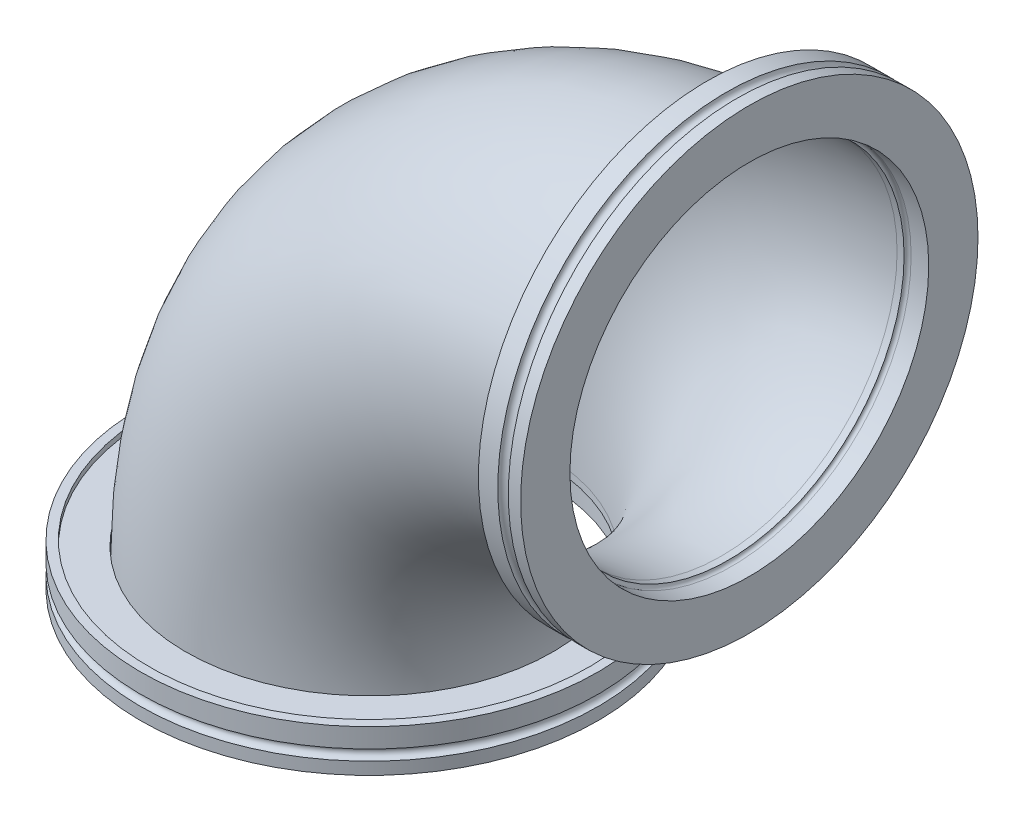
ISO-10303-21;
HEADER;
FILE_DESCRIPTION(('STEP AP214'),'2;1');
FILE_NAME('part.step','',(''),(''),'','','');
FILE_SCHEMA(('AUTOMOTIVE_DESIGN { 1 0 10303 214 1 1 1 1 }'));
ENDSEC;
DATA;
#1=APPLICATION_CONTEXT('core data for automotive mechanical design processes');
#2=APPLICATION_PROTOCOL_DEFINITION('international standard','automotive_design',2000,#1);
#3=PRODUCT_CONTEXT('',#1,'mechanical');
#4=PRODUCT('Part','Part','',(#3));
#5=PRODUCT_RELATED_PRODUCT_CATEGORY('part','',(#4));
#6=PRODUCT_DEFINITION_FORMATION('','',#4);
#7=PRODUCT_DEFINITION_CONTEXT('part definition',#1,'design');
#8=PRODUCT_DEFINITION('design','',#6,#7);
#9=PRODUCT_DEFINITION_SHAPE('','',#8);
#10=(LENGTH_UNIT() NAMED_UNIT(*) SI_UNIT(.MILLI.,.METRE.));
#11=(NAMED_UNIT(*) PLANE_ANGLE_UNIT() SI_UNIT($,.RADIAN.));
#12=(NAMED_UNIT(*) SI_UNIT($,.STERADIAN.) SOLID_ANGLE_UNIT());
#13=UNCERTAINTY_MEASURE_WITH_UNIT(LENGTH_MEASURE(1.E-05),#10,'distance_accuracy_value','');
#14=(GEOMETRIC_REPRESENTATION_CONTEXT(3) GLOBAL_UNCERTAINTY_ASSIGNED_CONTEXT((#13)) GLOBAL_UNIT_ASSIGNED_CONTEXT((#10,
#11,#12)) REPRESENTATION_CONTEXT('',''));
#15=CARTESIAN_POINT('',(0.,0.,0.));
#16=DIRECTION('',(0.,0.,1.));
#17=DIRECTION('',(1.,0.,0.));
#18=AXIS2_PLACEMENT_3D('',#15,#16,#17);
#19=CARTESIAN_POINT('',(3.50414142147315E-13,100.,3.49469700387223E-13));
#20=DIRECTION('',(-1.,0.,0.));
#21=DIRECTION('',(0.,0.,1.));
#22=AXIS2_PLACEMENT_3D('',#19,#20,#21);
#23=PLANE('',#22);
#24=CARTESIAN_POINT('',(3.49148133884313E-13,100.,0.));
#25=DIRECTION('',(1.,0.,0.));
#26=DIRECTION('',(0.,0.,1.));
#27=AXIS2_PLACEMENT_3D('',#24,#25,#26);
#28=CIRCLE('',#27,52.);
#29=CARTESIAN_POINT('',(1.6759110426447E-13,48.,0.));
#30=VERTEX_POINT('',#29);
#31=EDGE_CURVE('E96',#30,#30,#28,.T.);
#32=ORIENTED_EDGE('',*,*,#31,.T.);
#33=EDGE_LOOP('',(#32));
#34=FACE_BOUND('',#33,.T.);
#35=CARTESIAN_POINT('',(3.50414142147315E-13,100.,3.49469700387223E-13));
#36=DIRECTION('',(-1.,0.,0.));
#37=DIRECTION('',(0.,0.,1.));
#38=AXIS2_PLACEMENT_3D('',#35,#36,#37);
#39=CIRCLE('',#38,52.15);
#40=CARTESIAN_POINT('',(3.56800464282499E-13,100.,-52.15));
#41=VERTEX_POINT('',#40);
#42=EDGE_CURVE('E183',#41,#41,#39,.T.);
#43=ORIENTED_EDGE('',*,*,#42,.T.);
#44=EDGE_LOOP('',(#43));
#45=FACE_BOUND('',#44,.T.);
#46=ADVANCED_FACE('F17',(#34,#45),#23,.T.);
#47=CARTESIAN_POINT('',(-2.49999999999965,100.,3.49163548798767E-13));
#48=DIRECTION('',(-1.,0.,0.));
#49=DIRECTION('',(0.,0.,1.));
#50=AXIS2_PLACEMENT_3D('',#47,#48,#49);
#51=PLANE('',#50);
#52=CARTESIAN_POINT('',(-2.49999999999965,100.,3.49163548798767E-13));
#53=DIRECTION('',(-1.,0.,0.));
#54=DIRECTION('',(0.,0.,1.));
#55=AXIS2_PLACEMENT_3D('',#52,#53,#54);
#56=CIRCLE('',#55,52.15);
#57=CARTESIAN_POINT('',(-2.49999999999964,100.,-52.15));
#58=VERTEX_POINT('',#57);
#59=EDGE_CURVE('E288',#58,#58,#56,.T.);
#60=ORIENTED_EDGE('',*,*,#59,.F.);
#61=EDGE_LOOP('',(#60));
#62=FACE_BOUND('',#61,.T.);
#63=CARTESIAN_POINT('',(-2.49999999999965,100.,3.49163548798767E-13));
#64=DIRECTION('',(-1.,0.,0.));
#65=DIRECTION('',(0.,0.,1.));
#66=AXIS2_PLACEMENT_3D('',#63,#64,#65);
#67=CIRCLE('',#66,62.5);
#68=CARTESIAN_POINT('',(-2.49999999999964,100.,-62.5));
#69=VERTEX_POINT('',#68);
#70=EDGE_CURVE('E213',#69,#69,#67,.T.);
#71=ORIENTED_EDGE('',*,*,#70,.T.);
#72=EDGE_LOOP('',(#71));
#73=FACE_BOUND('',#72,.T.);
#74=ADVANCED_FACE('F542',(#62,#73),#51,.T.);
#75=CARTESIAN_POINT('',(-3.99999999999965,100.,3.48979857845694E-13));
#76=DIRECTION('',(1.,0.,0.));
#77=DIRECTION('',(0.,-1.,0.));
#78=AXIS2_PLACEMENT_3D('',#75,#76,#77);
#79=PLANE('',#78);
#80=CARTESIAN_POINT('',(-3.99999999999965,100.,3.48979857845694E-13));
#81=DIRECTION('',(-1.,0.,0.));
#82=DIRECTION('',(0.,0.,1.));
#83=AXIS2_PLACEMENT_3D('',#80,#81,#82);
#84=CIRCLE('',#83,62.5);
#85=CARTESIAN_POINT('',(-3.99999999999964,100.,-62.5));
#86=VERTEX_POINT('',#85);
#87=EDGE_CURVE('E138',#86,#86,#84,.T.);
#88=ORIENTED_EDGE('',*,*,#87,.F.);
#89=EDGE_LOOP('',(#88));
#90=FACE_BOUND('',#89,.T.);
#91=CARTESIAN_POINT('',(-3.99999999999965,100.,3.48979857845694E-13));
#92=DIRECTION('',(1.,0.,0.));
#93=DIRECTION('',(0.,0.,-1.));
#94=AXIS2_PLACEMENT_3D('',#91,#92,#93);
#95=CIRCLE('',#94,65.);
#96=CARTESIAN_POINT('',(-3.99999999999964,100.,-65.));
#97=VERTEX_POINT('',#96);
#98=EDGE_CURVE('E198',#97,#97,#95,.T.);
#99=ORIENTED_EDGE('',*,*,#98,.F.);
#100=EDGE_LOOP('',(#99));
#101=FACE_BOUND('',#100,.T.);
#102=ADVANCED_FACE('F523',(#90,#101),#79,.F.);
#103=CARTESIAN_POINT('',(8.00000000000035,100.,3.50449385470281E-13));
#104=DIRECTION('',(1.,0.,0.));
#105=DIRECTION('',(0.,-1.,0.));
#106=AXIS2_PLACEMENT_3D('',#103,#104,#105);
#107=PLANE('',#106);
#108=CARTESIAN_POINT('',(8.00000000000035,100.,3.50449385470281E-13));
#109=DIRECTION('',(1.,0.,0.));
#110=DIRECTION('',(0.,0.,-1.));
#111=AXIS2_PLACEMENT_3D('',#108,#109,#110);
#112=CIRCLE('',#111,51.);
#113=CARTESIAN_POINT('',(8.00000000000034,100.,51.));
#114=VERTEX_POINT('',#113);
#115=EDGE_CURVE('E223',#114,#114,#112,.T.);
#116=ORIENTED_EDGE('',*,*,#115,.F.);
#117=EDGE_LOOP('',(#116));
#118=FACE_BOUND('',#117,.T.);
#119=CARTESIAN_POINT('',(8.00000000000035,100.,3.50449385470281E-13));
#120=DIRECTION('',(1.,0.,0.));
#121=DIRECTION('',(0.,0.,-1.));
#122=AXIS2_PLACEMENT_3D('',#119,#120,#121);
#123=CIRCLE('',#122,65.);
#124=CARTESIAN_POINT('',(8.00000000000036,100.,-65.));
#125=VERTEX_POINT('',#124);
#126=EDGE_CURVE('E239',#125,#125,#123,.T.);
#127=ORIENTED_EDGE('',*,*,#126,.T.);
#128=EDGE_LOOP('',(#127));
#129=FACE_BOUND('',#128,.T.);
#130=ADVANCED_FACE('F518',(#118,#129),#107,.T.);
#131=CARTESIAN_POINT('',(-100.,0.,0.));
#132=DIRECTION('',(0.,1.,0.));
#133=DIRECTION('',(1.,0.,0.));
#134=AXIS2_PLACEMENT_3D('',#131,#132,#133);
#135=PLANE('',#134);
#136=CARTESIAN_POINT('',(-100.,0.,0.));
#137=DIRECTION('',(0.,-1.,0.));
#138=DIRECTION('',(0.,0.,1.));
#139=AXIS2_PLACEMENT_3D('',#136,#137,#138);
#140=CIRCLE('',#139,52.);
#141=CARTESIAN_POINT('',(-48.,0.,0.));
#142=VERTEX_POINT('',#141);
#143=EDGE_CURVE('E244',#142,#142,#140,.T.);
#144=ORIENTED_EDGE('',*,*,#143,.T.);
#145=EDGE_LOOP('',(#144));
#146=FACE_BOUND('',#145,.T.);
#147=CARTESIAN_POINT('',(-100.,0.,0.));
#148=DIRECTION('',(0.,1.,0.));
#149=DIRECTION('',(-0.999936925767598,0.,0.0112314062541425));
#150=AXIS2_PLACEMENT_3D('',#147,#148,#149);
#151=CIRCLE('',#150,52.15);
#152=CARTESIAN_POINT('',(-47.8532893212198,0.,-0.585717836153536));
#153=VERTEX_POINT('',#152);
#154=EDGE_CURVE('E234',#153,#153,#151,.T.);
#155=ORIENTED_EDGE('',*,*,#154,.T.);
#156=EDGE_LOOP('',(#155));
#157=FACE_BOUND('',#156,.T.);
#158=ADVANCED_FACE('F370',(#146,#157),#135,.T.);
#159=CARTESIAN_POINT('',(-100.,2.5,0.));
#160=DIRECTION('',(0.,1.,0.));
#161=DIRECTION('',(1.,0.,0.));
#162=AXIS2_PLACEMENT_3D('',#159,#160,#161);
#163=PLANE('',#162);
#164=CARTESIAN_POINT('',(-100.,2.5,0.));
#165=DIRECTION('',(0.,1.,0.));
#166=DIRECTION('',(-0.999936925767598,0.,0.0112314062541425));
#167=AXIS2_PLACEMENT_3D('',#164,#165,#166);
#168=CIRCLE('',#167,52.15);
#169=CARTESIAN_POINT('',(-47.8532893212198,2.5,-0.585717836153536));
#170=VERTEX_POINT('',#169);
#171=EDGE_CURVE('E233',#170,#170,#168,.T.);
#172=ORIENTED_EDGE('',*,*,#171,.F.);
#173=EDGE_LOOP('',(#172));
#174=FACE_BOUND('',#173,.T.);
#175=CARTESIAN_POINT('',(-100.,2.5,0.));
#176=DIRECTION('',(0.,1.,0.));
#177=DIRECTION('',(-0.999936925767598,0.,0.0112314062541425));
#178=AXIS2_PLACEMENT_3D('',#175,#176,#177);
#179=CIRCLE('',#178,62.5);
#180=CARTESIAN_POINT('',(-37.5039421395251,2.5,-0.701962890883911));
#181=VERTEX_POINT('',#180);
#182=EDGE_CURVE('E228',#181,#181,#179,.T.);
#183=ORIENTED_EDGE('',*,*,#182,.T.);
#184=EDGE_LOOP('',(#183));
#185=FACE_BOUND('',#184,.T.);
#186=ADVANCED_FACE('F366',(#174,#185),#163,.T.);
#187=CARTESIAN_POINT('',(-100.,4.,0.));
#188=DIRECTION('',(0.,-1.,0.));
#189=DIRECTION('',(0.,0.,-1.));
#190=AXIS2_PLACEMENT_3D('',#187,#188,#189);
#191=PLANE('',#190);
#192=CARTESIAN_POINT('',(-100.,4.,0.));
#193=DIRECTION('',(0.,1.,0.));
#194=DIRECTION('',(-0.999936925767598,0.,0.0112314062541425));
#195=AXIS2_PLACEMENT_3D('',#192,#193,#194);
#196=CIRCLE('',#195,62.5);
#197=CARTESIAN_POINT('',(-37.5039421395251,4.,-0.701962890883911));
#198=VERTEX_POINT('',#197);
#199=EDGE_CURVE('E251',#198,#198,#196,.T.);
#200=ORIENTED_EDGE('',*,*,#199,.F.);
#201=EDGE_LOOP('',(#200));
#202=FACE_BOUND('',#201,.T.);
#203=CARTESIAN_POINT('',(-100.,4.,0.));
#204=DIRECTION('',(0.,-1.,0.));
#205=DIRECTION('',(0.999936925767598,0.,-0.0112314062541425));
#206=AXIS2_PLACEMENT_3D('',#203,#204,#205);
#207=CIRCLE('',#206,65.);
#208=CARTESIAN_POINT('',(-35.0040998251061,4.,-0.730041406519268));
#209=VERTEX_POINT('',#208);
#210=EDGE_CURVE('E257',#209,#209,#207,.T.);
#211=ORIENTED_EDGE('',*,*,#210,.F.);
#212=EDGE_LOOP('',(#211));
#213=FACE_BOUND('',#212,.T.);
#214=ADVANCED_FACE('F369',(#202,#213),#191,.F.);
#215=CARTESIAN_POINT('',(-100.,-8.,0.));
#216=DIRECTION('',(0.,-1.,0.));
#217=DIRECTION('',(0.,0.,-1.));
#218=AXIS2_PLACEMENT_3D('',#215,#216,#217);
#219=PLANE('',#218);
#220=CARTESIAN_POINT('',(-100.,-8.,0.));
#221=DIRECTION('',(0.,-1.,0.));
#222=DIRECTION('',(0.999936925767598,0.,-0.0112314062541425));
#223=AXIS2_PLACEMENT_3D('',#220,#221,#222);
#224=CIRCLE('',#223,51.);
#225=CARTESIAN_POINT('',(-150.996783214148,-8.,0.572801718961259));
#226=VERTEX_POINT('',#225);
#227=EDGE_CURVE('E21',#226,#226,#224,.T.);
#228=ORIENTED_EDGE('',*,*,#227,.F.);
#229=EDGE_LOOP('',(#228));
#230=FACE_BOUND('',#229,.T.);
#231=CARTESIAN_POINT('',(-100.,-8.,0.));
#232=DIRECTION('',(0.,-1.,0.));
#233=DIRECTION('',(0.999936925767598,0.,-0.0112314062541425));
#234=AXIS2_PLACEMENT_3D('',#231,#232,#233);
#235=CIRCLE('',#234,65.);
#236=CARTESIAN_POINT('',(-35.0040998251061,-8.,-0.730041406519268));
#237=VERTEX_POINT('',#236);
#238=EDGE_CURVE('E11',#237,#237,#235,.T.);
#239=ORIENTED_EDGE('',*,*,#238,.T.);
#240=EDGE_LOOP('',(#239));
#241=FACE_BOUND('',#240,.T.);
#242=ADVANCED_FACE('F380',(#230,#241),#219,.T.);
#243=CARTESIAN_POINT('',(-100.,-8.,0.));
#244=DIRECTION('',(0.,1.,0.));
#245=DIRECTION('',(-0.999936925767598,0.,0.0112314062541425));
#246=AXIS2_PLACEMENT_3D('',#243,#244,#245);
#247=CYLINDRICAL_SURFACE('',#246,65.);
#248=CARTESIAN_POINT('',(-100.,-4.5,0.));
#249=DIRECTION('',(0.,1.,0.));
#250=DIRECTION('',(-0.999936925767598,0.,0.0112314062541425));
#251=AXIS2_PLACEMENT_3D('',#248,#249,#250);
#252=CIRCLE('',#251,65.);
#253=CARTESIAN_POINT('',(-35.0040998251061,-4.5,-0.730041406519268));
#254=VERTEX_POINT('',#253);
#255=EDGE_CURVE('E173',#254,#254,#252,.T.);
#256=ORIENTED_EDGE('',*,*,#255,.F.);
#257=DIRECTION('',(0.,-1.,0.));
#258=VECTOR('',#257,1.);
#259=CARTESIAN_POINT('',(-35.0040998251061,-8.,-0.730041406519268));
#260=LINE('',#259,#258);
#261=EDGE_CURVE('E28',#254,#237,#260,.T.);
#262=ORIENTED_EDGE('',*,*,#261,.T.);
#263=ORIENTED_EDGE('',*,*,#238,.F.);
#264=ORIENTED_EDGE('',*,*,#261,.F.);
#265=EDGE_LOOP('',(#256,#262,#263,#264));
#266=FACE_BOUND('',#265,.T.);
#267=ADVANCED_FACE('F172',(#266),#247,.T.);
#268=CARTESIAN_POINT('',(-100.,-2.,0.));
#269=DIRECTION('',(0.,-1.,0.));
#270=DIRECTION('',(0.999936925767598,0.,-0.0112314062541425));
#271=AXIS2_PLACEMENT_3D('',#268,#269,#270);
#272=CYLINDRICAL_SURFACE('',#271,51.);
#273=CARTESIAN_POINT('',(-100.,-3.,0.));
#274=DIRECTION('',(0.,1.,0.));
#275=DIRECTION('',(0.999936925767598,0.,-0.0112314062541425));
#276=AXIS2_PLACEMENT_3D('',#273,#274,#275);
#277=CIRCLE('',#276,51.);
#278=CARTESIAN_POINT('',(-150.996783214148,-3.,0.572801718961259));
#279=VERTEX_POINT('',#278);
#280=EDGE_CURVE('E316',#279,#279,#277,.T.);
#281=ORIENTED_EDGE('',*,*,#280,.T.);
#282=DIRECTION('',(0.,-1.,0.));
#283=VECTOR('',#282,1.);
#284=CARTESIAN_POINT('',(-150.996783214148,-2.,0.572801718961259));
#285=LINE('',#284,#283);
#286=EDGE_CURVE('E320',#279,#226,#285,.T.);
#287=ORIENTED_EDGE('',*,*,#286,.T.);
#288=ORIENTED_EDGE('',*,*,#227,.T.);
#289=ORIENTED_EDGE('',*,*,#286,.F.);
#290=EDGE_LOOP('',(#281,#287,#288,#289));
#291=FACE_BOUND('',#290,.T.);
#292=ADVANCED_FACE('F499',(#291),#272,.F.);
#293=CARTESIAN_POINT('',(-100.,-3.,0.));
#294=DIRECTION('',(0.,-1.,0.));
#295=DIRECTION('',(0.999936925767598,0.,-0.0112314062541425));
#296=AXIS2_PLACEMENT_3D('',#293,#294,#295);
#297=TOROIDAL_SURFACE('',#296,50.,1.);
#298=CARTESIAN_POINT('',(-100.,-2.,0.));
#299=DIRECTION('',(0.,-1.,0.));
#300=DIRECTION('',(0.999936925767598,0.,-0.0112314062541425));
#301=AXIS2_PLACEMENT_3D('',#298,#299,#300);
#302=CIRCLE('',#301,50.);
#303=CARTESIAN_POINT('',(-149.99684628838,-2.,0.561570312707129));
#304=VERTEX_POINT('',#303);
#305=CARTESIAN_POINT('',(-50.0031537116201,-2.,-0.561570312707129));
#306=VERTEX_POINT('',#305);
#307=EDGE_CURVE('E262',#304,#306,#302,.T.);
#308=ORIENTED_EDGE('',*,*,#307,.F.);
#309=CARTESIAN_POINT('',(-149.99684628838,-3.,0.561570312707117));
#310=DIRECTION('',(0.0112314062541423,0.,0.999936925767598));
#311=DIRECTION('',(-0.999936925767598,0.,0.0112314062541423));
#312=AXIS2_PLACEMENT_3D('',#309,#310,#311);
#313=CIRCLE('',#312,1.);
#314=EDGE_CURVE('E321',#304,#279,#313,.T.);
#315=ORIENTED_EDGE('',*,*,#314,.T.);
#316=ORIENTED_EDGE('',*,*,#280,.F.);
#317=ORIENTED_EDGE('',*,*,#314,.F.);
#318=CARTESIAN_POINT('',(-100.,-2.,0.));
#319=DIRECTION('',(0.,-1.,0.));
#320=DIRECTION('',(0.999936925767598,0.,-0.0112314062541425));
#321=AXIS2_PLACEMENT_3D('',#318,#319,#320);
#322=CIRCLE('',#321,50.);
#323=EDGE_CURVE('E196',#306,#304,#322,.T.);
#324=ORIENTED_EDGE('',*,*,#323,.F.);
#325=EDGE_LOOP('',(#308,#315,#316,#317,#324));
#326=FACE_BOUND('',#325,.T.);
#327=ADVANCED_FACE('F602',(#326),#297,.F.);
#328=CARTESIAN_POINT('',(-100.,-8.,0.));
#329=DIRECTION('',(0.,1.,0.));
#330=DIRECTION('',(-0.999936925767598,0.,0.0112314062541425));
#331=AXIS2_PLACEMENT_3D('',#328,#329,#330);
#332=CYLINDRICAL_SURFACE('',#331,50.);
#333=ORIENTED_EDGE('',*,*,#307,.T.);
#334=DIRECTION('',(0.,1.,0.));
#335=VECTOR('',#334,1.);
#336=CARTESIAN_POINT('',(-50.0031537116201,-8.,-0.561570312707129));
#337=LINE('',#336,#335);
#338=CARTESIAN_POINT('',(-50.0031537116201,0.,-0.561570312707129));
#339=VERTEX_POINT('',#338);
#340=EDGE_CURVE('E265',#306,#339,#337,.T.);
#341=ORIENTED_EDGE('',*,*,#340,.T.);
#342=CARTESIAN_POINT('',(-100.,0.,0.));
#343=DIRECTION('',(0.,1.,0.));
#344=DIRECTION('',(-0.999936925767598,0.,0.0112314062541425));
#345=AXIS2_PLACEMENT_3D('',#342,#343,#344);
#346=CIRCLE('',#345,50.);
#347=CARTESIAN_POINT('',(-50.,0.,0.));
#348=VERTEX_POINT('',#347);
#349=EDGE_CURVE('E322',#339,#348,#346,.T.);
#350=ORIENTED_EDGE('',*,*,#349,.T.);
#351=CARTESIAN_POINT('',(-100.,0.,0.));
#352=DIRECTION('',(0.,1.,0.));
#353=DIRECTION('',(-0.999936925767598,0.,0.0112314062541425));
#354=AXIS2_PLACEMENT_3D('',#351,#352,#353);
#355=CIRCLE('',#354,50.);
#356=EDGE_CURVE('E217',#348,#339,#355,.T.);
#357=ORIENTED_EDGE('',*,*,#356,.T.);
#358=ORIENTED_EDGE('',*,*,#340,.F.);
#359=ORIENTED_EDGE('',*,*,#323,.T.);
#360=EDGE_LOOP('',(#333,#341,#350,#357,#358,#359));
#361=FACE_BOUND('',#360,.T.);
#362=ADVANCED_FACE('F533',(#361),#332,.F.);
#363=CARTESIAN_POINT('',(-100.,-8.,0.));
#364=DIRECTION('',(0.,1.,0.));
#365=DIRECTION('',(-0.999936925767598,0.,0.0112314062541425));
#366=AXIS2_PLACEMENT_3D('',#363,#364,#365);
#367=CYLINDRICAL_SURFACE('',#366,65.);
#368=ORIENTED_EDGE('',*,*,#210,.T.);
#369=DIRECTION('',(0.,-1.,0.));
#370=VECTOR('',#369,1.);
#371=CARTESIAN_POINT('',(-35.0040998251061,-8.,-0.730041406519268));
#372=LINE('',#371,#370);
#373=CARTESIAN_POINT('',(-35.0040998251061,-1.5,-0.730041406519252));
#374=VERTEX_POINT('',#373);
#375=EDGE_CURVE('E266',#209,#374,#372,.T.);
#376=ORIENTED_EDGE('',*,*,#375,.T.);
#377=CARTESIAN_POINT('',(-100.,-1.5,0.));
#378=DIRECTION('',(0.,-1.,0.));
#379=DIRECTION('',(0.999936925767598,0.,-0.0112314062541425));
#380=AXIS2_PLACEMENT_3D('',#377,#378,#379);
#381=CIRCLE('',#380,65.);
#382=EDGE_CURVE('E193',#374,#374,#381,.T.);
#383=ORIENTED_EDGE('',*,*,#382,.F.);
#384=ORIENTED_EDGE('',*,*,#375,.F.);
#385=EDGE_LOOP('',(#368,#376,#383,#384));
#386=FACE_BOUND('',#385,.T.);
#387=ADVANCED_FACE('F383',(#386),#367,.T.);
#388=CARTESIAN_POINT('',(-100.,2.5,0.));
#389=DIRECTION('',(0.,1.,0.));
#390=DIRECTION('',(-0.999936925767598,0.,0.0112314062541425));
#391=AXIS2_PLACEMENT_3D('',#388,#389,#390);
#392=CYLINDRICAL_SURFACE('',#391,62.5);
#393=ORIENTED_EDGE('',*,*,#182,.F.);
#394=DIRECTION('',(0.,1.,0.));
#395=VECTOR('',#394,1.);
#396=CARTESIAN_POINT('',(-37.5039421395251,2.5,-0.701962890883911));
#397=LINE('',#396,#395);
#398=EDGE_CURVE('E232',#181,#198,#397,.T.);
#399=ORIENTED_EDGE('',*,*,#398,.T.);
#400=ORIENTED_EDGE('',*,*,#199,.T.);
#401=ORIENTED_EDGE('',*,*,#398,.F.);
#402=EDGE_LOOP('',(#393,#399,#400,#401));
#403=FACE_BOUND('',#402,.T.);
#404=ADVANCED_FACE('F375',(#403),#392,.F.);
#405=CARTESIAN_POINT('',(-100.,0.,0.));
#406=DIRECTION('',(0.,1.,0.));
#407=DIRECTION('',(-0.999936925767598,0.,0.0112314062541425));
#408=AXIS2_PLACEMENT_3D('',#405,#406,#407);
#409=CYLINDRICAL_SURFACE('',#408,52.15);
#410=ORIENTED_EDGE('',*,*,#154,.F.);
#411=DIRECTION('',(0.,1.,0.));
#412=VECTOR('',#411,1.);
#413=CARTESIAN_POINT('',(-47.8532893212198,0.,-0.585717836153536));
#414=LINE('',#413,#412);
#415=EDGE_CURVE('E238',#153,#170,#414,.T.);
#416=ORIENTED_EDGE('',*,*,#415,.T.);
#417=ORIENTED_EDGE('',*,*,#171,.T.);
#418=ORIENTED_EDGE('',*,*,#415,.F.);
#419=EDGE_LOOP('',(#410,#416,#417,#418));
#420=FACE_BOUND('',#419,.T.);
#421=ADVANCED_FACE('F364',(#420),#409,.F.);
#422=CARTESIAN_POINT('',(8.00000000000035,100.,3.50449385470281E-13));
#423=DIRECTION('',(-1.,0.,0.));
#424=DIRECTION('',(0.,0.,1.));
#425=AXIS2_PLACEMENT_3D('',#422,#423,#424);
#426=CYLINDRICAL_SURFACE('',#425,65.);
#427=CARTESIAN_POINT('',(4.50000000000035,100.,3.50020773246443E-13));
#428=DIRECTION('',(-1.,0.,0.));
#429=DIRECTION('',(0.,0.,1.));
#430=AXIS2_PLACEMENT_3D('',#427,#428,#429);
#431=CIRCLE('',#430,65.);
#432=CARTESIAN_POINT('',(4.50000000000036,100.,-65.));
#433=VERTEX_POINT('',#432);
#434=EDGE_CURVE('E296',#433,#433,#431,.T.);
#435=ORIENTED_EDGE('',*,*,#434,.F.);
#436=DIRECTION('',(1.,0.,0.));
#437=VECTOR('',#436,1.);
#438=CARTESIAN_POINT('',(8.00000000000036,100.,-65.));
#439=LINE('',#438,#437);
#440=EDGE_CURVE('E227',#433,#125,#439,.T.);
#441=ORIENTED_EDGE('',*,*,#440,.T.);
#442=ORIENTED_EDGE('',*,*,#126,.F.);
#443=ORIENTED_EDGE('',*,*,#440,.F.);
#444=EDGE_LOOP('',(#435,#441,#442,#443));
#445=FACE_BOUND('',#444,.T.);
#446=ADVANCED_FACE('F461',(#445),#426,.T.);
#447=CARTESIAN_POINT('',(2.00000000000035,100.,3.49714621657987E-13));
#448=DIRECTION('',(1.,0.,0.));
#449=DIRECTION('',(0.,0.,-1.));
#450=AXIS2_PLACEMENT_3D('',#447,#448,#449);
#451=CYLINDRICAL_SURFACE('',#450,51.);
#452=CARTESIAN_POINT('',(3.00000000000035,100.,3.49837082293369E-13));
#453=DIRECTION('',(-1.,0.,0.));
#454=DIRECTION('',(0.,0.,-1.));
#455=AXIS2_PLACEMENT_3D('',#452,#453,#454);
#456=CIRCLE('',#455,51.);
#457=CARTESIAN_POINT('',(3.00000000000035,100.,51.));
#458=VERTEX_POINT('',#457);
#459=EDGE_CURVE('E224',#458,#458,#456,.T.);
#460=ORIENTED_EDGE('',*,*,#459,.T.);
#461=DIRECTION('',(1.,0.,0.));
#462=VECTOR('',#461,1.);
#463=CARTESIAN_POINT('',(2.00000000000034,100.,51.));
#464=LINE('',#463,#462);
#465=EDGE_CURVE('E219',#458,#114,#464,.T.);
#466=ORIENTED_EDGE('',*,*,#465,.T.);
#467=ORIENTED_EDGE('',*,*,#115,.T.);
#468=ORIENTED_EDGE('',*,*,#465,.F.);
#469=EDGE_LOOP('',(#460,#466,#467,#468));
#470=FACE_BOUND('',#469,.T.);
#471=ADVANCED_FACE('F455',(#470),#451,.F.);
#472=CARTESIAN_POINT('',(3.00000000000035,100.,3.49837082293369E-13));
#473=DIRECTION('',(1.,0.,0.));
#474=DIRECTION('',(0.,0.,-1.));
#475=AXIS2_PLACEMENT_3D('',#472,#473,#474);
#476=TOROIDAL_SURFACE('',#475,50.,1.);
#477=CARTESIAN_POINT('',(2.00000000000035,100.,3.49714621657987E-13));
#478=DIRECTION('',(1.,0.,0.));
#479=DIRECTION('',(0.,0.,-1.));
#480=AXIS2_PLACEMENT_3D('',#477,#478,#479);
#481=CIRCLE('',#480,50.);
#482=CARTESIAN_POINT('',(2.00000000000034,100.,50.));
#483=VERTEX_POINT('',#482);
#484=CARTESIAN_POINT('',(2.00000000000036,100.,-50.));
#485=VERTEX_POINT('',#484);
#486=EDGE_CURVE('E208',#483,#485,#481,.T.);
#487=ORIENTED_EDGE('',*,*,#486,.F.);
#488=CARTESIAN_POINT('',(3.00000000000034,100.,50.));
#489=DIRECTION('',(0.,1.,0.));
#490=DIRECTION('',(0.,0.,1.));
#491=AXIS2_PLACEMENT_3D('',#488,#489,#490);
#492=CIRCLE('',#491,1.);
#493=EDGE_CURVE('E291',#483,#458,#492,.T.);
#494=ORIENTED_EDGE('',*,*,#493,.T.);
#495=ORIENTED_EDGE('',*,*,#459,.F.);
#496=ORIENTED_EDGE('',*,*,#493,.F.);
#497=CARTESIAN_POINT('',(2.00000000000035,100.,3.49714621657987E-13));
#498=DIRECTION('',(1.,0.,0.));
#499=DIRECTION('',(0.,0.,-1.));
#500=AXIS2_PLACEMENT_3D('',#497,#498,#499);
#501=CIRCLE('',#500,50.);
#502=EDGE_CURVE('E295',#485,#483,#501,.T.);
#503=ORIENTED_EDGE('',*,*,#502,.F.);
#504=EDGE_LOOP('',(#487,#494,#495,#496,#503));
#505=FACE_BOUND('',#504,.T.);
#506=ADVANCED_FACE('F460',(#505),#476,.F.);
#507=CARTESIAN_POINT('',(8.00000000000035,100.,3.50449385470281E-13));
#508=DIRECTION('',(-1.,0.,0.));
#509=DIRECTION('',(0.,0.,1.));
#510=AXIS2_PLACEMENT_3D('',#507,#508,#509);
#511=CYLINDRICAL_SURFACE('',#510,50.);
#512=ORIENTED_EDGE('',*,*,#486,.T.);
#513=DIRECTION('',(-1.,0.,0.));
#514=VECTOR('',#513,1.);
#515=CARTESIAN_POINT('',(8.00000000000036,100.,-50.));
#516=LINE('',#515,#514);
#517=CARTESIAN_POINT('',(3.48610029732299E-13,100.,-50.));
#518=VERTEX_POINT('',#517);
#519=EDGE_CURVE('E82',#485,#518,#516,.T.);
#520=ORIENTED_EDGE('',*,*,#519,.T.);
#521=CARTESIAN_POINT('',(3.49148133884313E-13,100.,0.));
#522=DIRECTION('',(1.,0.,0.));
#523=DIRECTION('',(0.,1.,0.));
#524=AXIS2_PLACEMENT_3D('',#521,#522,#523);
#525=CIRCLE('',#524,50.);
#526=CARTESIAN_POINT('',(1.74574066942157E-13,50.,0.));
#527=VERTEX_POINT('',#526);
#528=EDGE_CURVE('E258',#527,#518,#525,.T.);
#529=ORIENTED_EDGE('',*,*,#528,.F.);
#530=CARTESIAN_POINT('',(3.49148133884313E-13,100.,0.));
#531=DIRECTION('',(1.,0.,0.));
#532=DIRECTION('',(0.,1.,0.));
#533=AXIS2_PLACEMENT_3D('',#530,#531,#532);
#534=CIRCLE('',#533,50.);
#535=EDGE_CURVE('E287',#518,#527,#534,.T.);
#536=ORIENTED_EDGE('',*,*,#535,.F.);
#537=ORIENTED_EDGE('',*,*,#519,.F.);
#538=ORIENTED_EDGE('',*,*,#502,.T.);
#539=EDGE_LOOP('',(#512,#520,#529,#536,#537,#538));
#540=FACE_BOUND('',#539,.T.);
#541=ADVANCED_FACE('F19',(#540),#511,.F.);
#542=CARTESIAN_POINT('',(8.00000000000035,100.,3.50449385470281E-13));
#543=DIRECTION('',(-1.,0.,0.));
#544=DIRECTION('',(0.,0.,1.));
#545=AXIS2_PLACEMENT_3D('',#542,#543,#544);
#546=CYLINDRICAL_SURFACE('',#545,65.);
#547=ORIENTED_EDGE('',*,*,#98,.T.);
#548=DIRECTION('',(1.,0.,0.));
#549=VECTOR('',#548,1.);
#550=CARTESIAN_POINT('',(8.00000000000036,100.,-65.));
#551=LINE('',#550,#549);
#552=CARTESIAN_POINT('',(1.50000000000036,100.,-65.));
#553=VERTEX_POINT('',#552);
#554=EDGE_CURVE('E201',#97,#553,#551,.T.);
#555=ORIENTED_EDGE('',*,*,#554,.T.);
#556=CARTESIAN_POINT('',(1.50000000000035,100.,3.49653391340296E-13));
#557=DIRECTION('',(1.,0.,0.));
#558=DIRECTION('',(0.,0.,-1.));
#559=AXIS2_PLACEMENT_3D('',#556,#557,#558);
#560=CIRCLE('',#559,65.);
#561=EDGE_CURVE('E261',#553,#553,#560,.T.);
#562=ORIENTED_EDGE('',*,*,#561,.F.);
#563=ORIENTED_EDGE('',*,*,#554,.F.);
#564=EDGE_LOOP('',(#547,#555,#562,#563));
#565=FACE_BOUND('',#564,.T.);
#566=ADVANCED_FACE('F474',(#565),#546,.T.);
#567=CARTESIAN_POINT('',(-2.49999999999965,100.,3.49163548798767E-13));
#568=DIRECTION('',(-1.,0.,0.));
#569=DIRECTION('',(0.,0.,1.));
#570=AXIS2_PLACEMENT_3D('',#567,#568,#569);
#571=CYLINDRICAL_SURFACE('',#570,62.5);
#572=ORIENTED_EDGE('',*,*,#70,.F.);
#573=DIRECTION('',(-1.,0.,0.));
#574=VECTOR('',#573,1.);
#575=CARTESIAN_POINT('',(-2.49999999999964,100.,-62.5));
#576=LINE('',#575,#574);
#577=EDGE_CURVE('E144',#69,#86,#576,.T.);
#578=ORIENTED_EDGE('',*,*,#577,.T.);
#579=ORIENTED_EDGE('',*,*,#87,.T.);
#580=ORIENTED_EDGE('',*,*,#577,.F.);
#581=EDGE_LOOP('',(#572,#578,#579,#580));
#582=FACE_BOUND('',#581,.T.);
#583=ADVANCED_FACE('F468',(#582),#571,.F.);
#584=CARTESIAN_POINT('',(3.50414142147315E-13,100.,3.49469700387223E-13));
#585=DIRECTION('',(-1.,0.,0.));
#586=DIRECTION('',(0.,0.,1.));
#587=AXIS2_PLACEMENT_3D('',#584,#585,#586);
#588=CYLINDRICAL_SURFACE('',#587,52.15);
#589=ORIENTED_EDGE('',*,*,#42,.F.);
#590=DIRECTION('',(-1.,0.,0.));
#591=VECTOR('',#590,1.);
#592=CARTESIAN_POINT('',(3.56800464282499E-13,100.,-52.15));
#593=LINE('',#592,#591);
#594=EDGE_CURVE('E191',#41,#58,#593,.T.);
#595=ORIENTED_EDGE('',*,*,#594,.T.);
#596=ORIENTED_EDGE('',*,*,#59,.T.);
#597=ORIENTED_EDGE('',*,*,#594,.F.);
#598=EDGE_LOOP('',(#589,#595,#596,#597));
#599=FACE_BOUND('',#598,.T.);
#600=ADVANCED_FACE('F473',(#599),#588,.F.);
#601=CARTESIAN_POINT('',(-100.,-3.,0.));
#602=DIRECTION('',(0.,1.,0.));
#603=DIRECTION('',(-0.999936925767598,0.,0.0112314062541425));
#604=AXIS2_PLACEMENT_3D('',#601,#602,#603);
#605=TOROIDAL_SURFACE('',#604,65.,1.5);
#606=ORIENTED_EDGE('',*,*,#382,.T.);
#607=CARTESIAN_POINT('',(-35.0040998251061,-3.,-0.730041406519268));
#608=DIRECTION('',(0.0112314062541426,0.,0.999936925767598));
#609=DIRECTION('',(0.999936925767598,0.,-0.0112314062541426));
#610=AXIS2_PLACEMENT_3D('',#607,#608,#609);
#611=CIRCLE('',#610,1.5);
#612=EDGE_CURVE('E181',#374,#254,#611,.T.);
#613=ORIENTED_EDGE('',*,*,#612,.T.);
#614=ORIENTED_EDGE('',*,*,#255,.T.);
#615=ORIENTED_EDGE('',*,*,#612,.F.);
#616=EDGE_LOOP('',(#606,#613,#614,#615));
#617=FACE_BOUND('',#616,.T.);
#618=ADVANCED_FACE('F180',(#617),#605,.F.);
#619=CARTESIAN_POINT('',(3.00000000000035,100.,3.49837082293369E-13));
#620=DIRECTION('',(-1.,0.,0.));
#621=DIRECTION('',(0.,0.,1.));
#622=AXIS2_PLACEMENT_3D('',#619,#620,#621);
#623=TOROIDAL_SURFACE('',#622,65.,1.5);
#624=ORIENTED_EDGE('',*,*,#561,.T.);
#625=CARTESIAN_POINT('',(3.00000000000036,100.,-65.));
#626=DIRECTION('',(0.,1.,0.));
#627=DIRECTION('',(0.,0.,-1.));
#628=AXIS2_PLACEMENT_3D('',#625,#626,#627);
#629=CIRCLE('',#628,1.5);
#630=EDGE_CURVE('E299',#553,#433,#629,.T.);
#631=ORIENTED_EDGE('',*,*,#630,.T.);
#632=ORIENTED_EDGE('',*,*,#434,.T.);
#633=ORIENTED_EDGE('',*,*,#630,.F.);
#634=EDGE_LOOP('',(#624,#631,#632,#633));
#635=FACE_BOUND('',#634,.T.);
#636=ADVANCED_FACE('F572',(#635),#623,.F.);
#637=CARTESIAN_POINT('',(0.,0.,0.));
#638=DIRECTION('',(0.,0.,1.));
#639=DIRECTION('',(1.,0.,0.));
#640=AXIS2_PLACEMENT_3D('',#637,#638,#639);
#641=TOROIDAL_SURFACE('',#640,100.,50.);
#642=ORIENTED_EDGE('',*,*,#535,.T.);
#643=CARTESIAN_POINT('',(0.,0.,0.));
#644=DIRECTION('',(0.,0.,1.));
#645=DIRECTION('',(1.,0.,0.));
#646=AXIS2_PLACEMENT_3D('',#643,#644,#645);
#647=CIRCLE('',#646,50.);
#648=EDGE_CURVE('E325',#527,#348,#647,.T.);
#649=ORIENTED_EDGE('',*,*,#648,.T.);
#650=ORIENTED_EDGE('',*,*,#349,.F.);
#651=ORIENTED_EDGE('',*,*,#356,.F.);
#652=ORIENTED_EDGE('',*,*,#648,.F.);
#653=ORIENTED_EDGE('',*,*,#528,.T.);
#654=EDGE_LOOP('',(#642,#649,#650,#651,#652,#653));
#655=FACE_BOUND('',#654,.T.);
#656=ADVANCED_FACE('F563',(#655),#641,.F.);
#657=CARTESIAN_POINT('',(0.,0.,0.));
#658=DIRECTION('',(0.,0.,1.));
#659=DIRECTION('',(1.,0.,0.));
#660=AXIS2_PLACEMENT_3D('',#657,#658,#659);
#661=TOROIDAL_SURFACE('',#660,100.,52.);
#662=ORIENTED_EDGE('',*,*,#143,.F.);
#663=CARTESIAN_POINT('',(0.,0.,0.));
#664=DIRECTION('',(0.,0.,-1.));
#665=DIRECTION('',(1.,0.,0.));
#666=AXIS2_PLACEMENT_3D('',#663,#664,#665);
#667=CIRCLE('',#666,48.);
#668=EDGE_CURVE('E240',#142,#30,#667,.T.);
#669=ORIENTED_EDGE('',*,*,#668,.T.);
#670=ORIENTED_EDGE('',*,*,#31,.F.);
#671=ORIENTED_EDGE('',*,*,#668,.F.);
#672=EDGE_LOOP('',(#662,#669,#670,#671));
#673=FACE_BOUND('',#672,.T.);
#674=ADVANCED_FACE('F558',(#673),#661,.T.);
#675=CLOSED_SHELL('',(#46,#74,#102,#130,#158,#186,#214,#242,#267,#292,#327,#362,#387,#404,#421,
#446,#471,#506,#541,#566,#583,#600,#618,#636,#656,#674));
#676=MANIFOLD_SOLID_BREP('B1',#675);
#677=ADVANCED_BREP_SHAPE_REPRESENTATION('',(#18,#676),#14);
#678=SHAPE_DEFINITION_REPRESENTATION(#9,#677);
ENDSEC;
END-ISO-10303-21;
